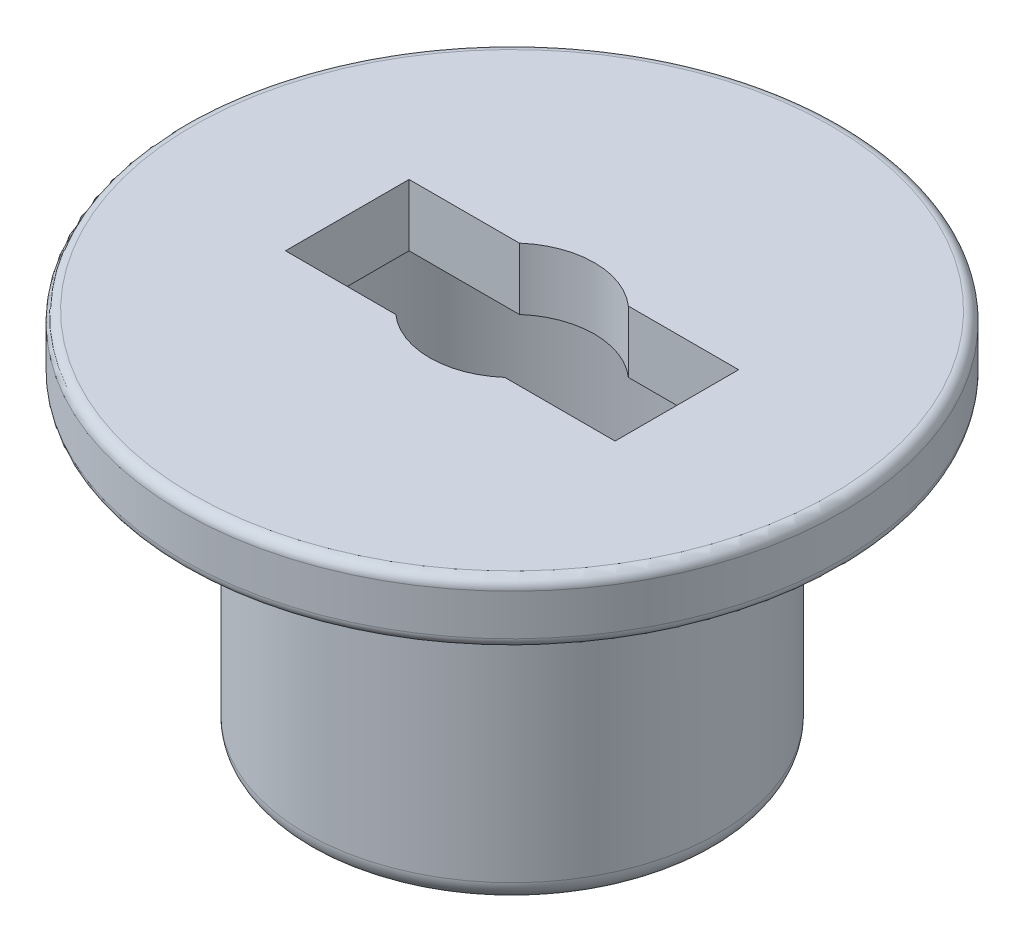
ISO-10303-21;
HEADER;
FILE_DESCRIPTION(('STEP AP214'),'2;1');
FILE_NAME('part.step','',(''),(''),'','','');
FILE_SCHEMA(('AUTOMOTIVE_DESIGN { 1 0 10303 214 1 1 1 1 }'));
ENDSEC;
DATA;
#1=APPLICATION_CONTEXT('core data for automotive mechanical design processes');
#2=APPLICATION_PROTOCOL_DEFINITION('international standard','automotive_design',2000,#1);
#3=PRODUCT_CONTEXT('',#1,'mechanical');
#4=PRODUCT('Part','Part','',(#3));
#5=PRODUCT_RELATED_PRODUCT_CATEGORY('part','',(#4));
#6=PRODUCT_DEFINITION_FORMATION('','',#4);
#7=PRODUCT_DEFINITION_CONTEXT('part definition',#1,'design');
#8=PRODUCT_DEFINITION('design','',#6,#7);
#9=PRODUCT_DEFINITION_SHAPE('','',#8);
#10=(LENGTH_UNIT() NAMED_UNIT(*) SI_UNIT(.MILLI.,.METRE.));
#11=(NAMED_UNIT(*) PLANE_ANGLE_UNIT() SI_UNIT($,.RADIAN.));
#12=(NAMED_UNIT(*) SI_UNIT($,.STERADIAN.) SOLID_ANGLE_UNIT());
#13=UNCERTAINTY_MEASURE_WITH_UNIT(LENGTH_MEASURE(1.E-05),#10,'distance_accuracy_value','');
#14=(GEOMETRIC_REPRESENTATION_CONTEXT(3) GLOBAL_UNCERTAINTY_ASSIGNED_CONTEXT((#13)) GLOBAL_UNIT_ASSIGNED_CONTEXT((#10,
#11,#12)) REPRESENTATION_CONTEXT('',''));
#15=CARTESIAN_POINT('',(0.,0.,0.));
#16=DIRECTION('',(0.,0.,1.));
#17=DIRECTION('',(1.,0.,0.));
#18=AXIS2_PLACEMENT_3D('',#15,#16,#17);
#19=CARTESIAN_POINT('',(0.,3.,0.));
#20=DIRECTION('',(0.,1.,0.));
#21=DIRECTION('',(0.,0.,1.));
#22=AXIS2_PLACEMENT_3D('',#19,#20,#21);
#23=PLANE('',#22);
#24=CARTESIAN_POINT('',(0.,3.,0.));
#25=DIRECTION('',(0.,1.,0.));
#26=DIRECTION('',(0.,0.,1.));
#27=AXIS2_PLACEMENT_3D('',#24,#25,#26);
#28=CIRCLE('',#27,15.5);
#29=CARTESIAN_POINT('',(0.,3.,15.5));
#30=VERTEX_POINT('',#29);
#31=EDGE_CURVE('E11',#30,#30,#28,.T.);
#32=ORIENTED_EDGE('',*,*,#31,.T.);
#33=EDGE_LOOP('',(#32));
#34=FACE_BOUND('',#33,.T.);
#35=DIRECTION('',(0.,0.,-1.));
#36=VECTOR('',#35,1.);
#37=CARTESIAN_POINT('',(8.,3.,-3.));
#38=LINE('',#37,#36);
#39=CARTESIAN_POINT('',(8.,3.,3.));
#40=VERTEX_POINT('',#39);
#41=CARTESIAN_POINT('',(8.,3.,-3.));
#42=VERTEX_POINT('',#41);
#43=EDGE_CURVE('E227',#40,#42,#38,.T.);
#44=ORIENTED_EDGE('',*,*,#43,.F.);
#45=DIRECTION('',(1.,0.,0.));
#46=VECTOR('',#45,1.);
#47=CARTESIAN_POINT('',(2.64575131106459,3.,3.));
#48=LINE('',#47,#46);
#49=CARTESIAN_POINT('',(2.64575131106459,3.,3.));
#50=VERTEX_POINT('',#49);
#51=EDGE_CURVE('E145',#50,#40,#48,.T.);
#52=ORIENTED_EDGE('',*,*,#51,.F.);
#53=CARTESIAN_POINT('',(0.,3.,0.));
#54=DIRECTION('',(0.,1.,0.));
#55=DIRECTION('',(0.,0.,1.));
#56=AXIS2_PLACEMENT_3D('',#53,#54,#55);
#57=CIRCLE('',#56,4.);
#58=CARTESIAN_POINT('',(-2.64575131106459,3.,3.));
#59=VERTEX_POINT('',#58);
#60=EDGE_CURVE('E56',#59,#50,#57,.T.);
#61=ORIENTED_EDGE('',*,*,#60,.F.);
#62=DIRECTION('',(1.,0.,0.));
#63=VECTOR('',#62,1.);
#64=CARTESIAN_POINT('',(-8.,3.,3.));
#65=LINE('',#64,#63);
#66=CARTESIAN_POINT('',(-8.,3.,3.));
#67=VERTEX_POINT('',#66);
#68=EDGE_CURVE('E121',#67,#59,#65,.T.);
#69=ORIENTED_EDGE('',*,*,#68,.F.);
#70=DIRECTION('',(0.,0.,1.));
#71=VECTOR('',#70,1.);
#72=CARTESIAN_POINT('',(-8.,3.,-3.));
#73=LINE('',#72,#71);
#74=CARTESIAN_POINT('',(-8.,3.,-3.));
#75=VERTEX_POINT('',#74);
#76=EDGE_CURVE('E109',#75,#67,#73,.T.);
#77=ORIENTED_EDGE('',*,*,#76,.F.);
#78=DIRECTION('',(-1.,0.,0.));
#79=VECTOR('',#78,1.);
#80=CARTESIAN_POINT('',(-8.,3.,-3.));
#81=LINE('',#80,#79);
#82=CARTESIAN_POINT('',(-2.64575131106459,3.,-3.));
#83=VERTEX_POINT('',#82);
#84=EDGE_CURVE('E97',#83,#75,#81,.T.);
#85=ORIENTED_EDGE('',*,*,#84,.F.);
#86=CARTESIAN_POINT('',(0.,3.,0.));
#87=DIRECTION('',(0.,1.,0.));
#88=DIRECTION('',(0.,0.,1.));
#89=AXIS2_PLACEMENT_3D('',#86,#87,#88);
#90=CIRCLE('',#89,4.);
#91=CARTESIAN_POINT('',(2.64575131106459,3.,-3.));
#92=VERTEX_POINT('',#91);
#93=EDGE_CURVE('E110',#92,#83,#90,.T.);
#94=ORIENTED_EDGE('',*,*,#93,.F.);
#95=DIRECTION('',(-1.,0.,0.));
#96=VECTOR('',#95,1.);
#97=CARTESIAN_POINT('',(2.64575131106459,3.,-3.));
#98=LINE('',#97,#96);
#99=EDGE_CURVE('E229',#42,#92,#98,.T.);
#100=ORIENTED_EDGE('',*,*,#99,.F.);
#101=EDGE_LOOP('',(#44,#52,#61,#69,#77,#85,#94,#100));
#102=FACE_BOUND('',#101,.T.);
#103=ADVANCED_FACE('F35',(#34,#102),#23,.T.);
#104=CARTESIAN_POINT('',(0.,0.,0.));
#105=DIRECTION('',(0.,1.,0.));
#106=DIRECTION('',(0.,0.,1.));
#107=AXIS2_PLACEMENT_3D('',#104,#105,#106);
#108=PLANE('',#107);
#109=CARTESIAN_POINT('',(0.,0.,0.));
#110=DIRECTION('',(0.,1.,0.));
#111=DIRECTION('',(0.,0.,1.));
#112=AXIS2_PLACEMENT_3D('',#109,#110,#111);
#113=CIRCLE('',#112,15.5);
#114=CARTESIAN_POINT('',(0.,0.,15.5));
#115=VERTEX_POINT('',#114);
#116=EDGE_CURVE('E43',#115,#115,#113,.F.);
#117=ORIENTED_EDGE('',*,*,#116,.T.);
#118=EDGE_LOOP('',(#117));
#119=FACE_BOUND('',#118,.T.);
#120=CARTESIAN_POINT('',(0.,0.,0.));
#121=DIRECTION('',(0.,1.,0.));
#122=DIRECTION('',(0.,0.,1.));
#123=AXIS2_PLACEMENT_3D('',#120,#121,#122);
#124=CIRCLE('',#123,10.);
#125=CARTESIAN_POINT('',(0.,0.,10.));
#126=VERTEX_POINT('',#125);
#127=EDGE_CURVE('E162',#126,#126,#124,.F.);
#128=ORIENTED_EDGE('',*,*,#127,.F.);
#129=EDGE_LOOP('',(#128));
#130=FACE_BOUND('',#129,.T.);
#131=CARTESIAN_POINT('',(-13.,0.,0.));
#132=DIRECTION('',(0.,1.,0.));
#133=DIRECTION('',(0.,0.,1.));
#134=AXIS2_PLACEMENT_3D('',#131,#132,#133);
#135=CIRCLE('',#134,1.);
#136=CARTESIAN_POINT('',(-13.,0.,1.));
#137=VERTEX_POINT('',#136);
#138=EDGE_CURVE('E159',#137,#137,#135,.F.);
#139=ORIENTED_EDGE('',*,*,#138,.F.);
#140=EDGE_LOOP('',(#139));
#141=FACE_BOUND('',#140,.T.);
#142=ADVANCED_FACE('F176',(#119,#130,#141),#108,.F.);
#143=CARTESIAN_POINT('',(0.,3.,0.));
#144=DIRECTION('',(0.,-1.,0.));
#145=DIRECTION('',(0.,0.,-1.));
#146=AXIS2_PLACEMENT_3D('',#143,#144,#145);
#147=CYLINDRICAL_SURFACE('',#146,16.);
#148=CARTESIAN_POINT('',(0.,0.5,0.));
#149=DIRECTION('',(0.,1.,0.));
#150=DIRECTION('',(0.,0.,1.));
#151=AXIS2_PLACEMENT_3D('',#148,#149,#150);
#152=CIRCLE('',#151,16.);
#153=CARTESIAN_POINT('',(0.,0.5,16.));
#154=VERTEX_POINT('',#153);
#155=EDGE_CURVE('E171',#154,#154,#152,.T.);
#156=ORIENTED_EDGE('',*,*,#155,.T.);
#157=EDGE_LOOP('',(#156));
#158=FACE_BOUND('',#157,.T.);
#159=CARTESIAN_POINT('',(0.,2.5,0.));
#160=DIRECTION('',(0.,1.,0.));
#161=DIRECTION('',(0.,0.,1.));
#162=AXIS2_PLACEMENT_3D('',#159,#160,#161);
#163=CIRCLE('',#162,16.);
#164=CARTESIAN_POINT('',(0.,2.5,16.));
#165=VERTEX_POINT('',#164);
#166=EDGE_CURVE('E168',#165,#165,#163,.F.);
#167=ORIENTED_EDGE('',*,*,#166,.T.);
#168=EDGE_LOOP('',(#167));
#169=FACE_BOUND('',#168,.T.);
#170=ADVANCED_FACE('F185',(#158,#169),#147,.T.);
#171=CARTESIAN_POINT('',(2.64575131106459,3.,3.));
#172=DIRECTION('',(0.,0.,-1.));
#173=DIRECTION('',(-1.,0.,0.));
#174=AXIS2_PLACEMENT_3D('',#171,#172,#173);
#175=PLANE('',#174);
#176=DIRECTION('',(1.,0.,0.));
#177=VECTOR('',#176,1.);
#178=CARTESIAN_POINT('',(2.64575131106459,0.,3.));
#179=LINE('',#178,#177);
#180=CARTESIAN_POINT('',(2.64575131106459,0.,3.));
#181=VERTEX_POINT('',#180);
#182=CARTESIAN_POINT('',(8.,0.,3.));
#183=VERTEX_POINT('',#182);
#184=EDGE_CURVE('E79',#181,#183,#179,.T.);
#185=ORIENTED_EDGE('',*,*,#184,.F.);
#186=DIRECTION('',(0.,-1.,0.));
#187=VECTOR('',#186,1.);
#188=CARTESIAN_POINT('',(2.64575131106459,3.,3.));
#189=LINE('',#188,#187);
#190=EDGE_CURVE('E127',#50,#181,#189,.T.);
#191=ORIENTED_EDGE('',*,*,#190,.F.);
#192=ORIENTED_EDGE('',*,*,#51,.T.);
#193=DIRECTION('',(0.,-1.,0.));
#194=VECTOR('',#193,1.);
#195=CARTESIAN_POINT('',(8.,3.,3.));
#196=LINE('',#195,#194);
#197=EDGE_CURVE('E156',#40,#183,#196,.T.);
#198=ORIENTED_EDGE('',*,*,#197,.T.);
#199=EDGE_LOOP('',(#185,#191,#192,#198));
#200=FACE_BOUND('',#199,.T.);
#201=ADVANCED_FACE('F188',(#200),#175,.T.);
#202=CARTESIAN_POINT('',(8.,3.,-3.));
#203=DIRECTION('',(-1.,0.,0.));
#204=DIRECTION('',(0.,0.,1.));
#205=AXIS2_PLACEMENT_3D('',#202,#203,#204);
#206=PLANE('',#205);
#207=DIRECTION('',(0.,0.,-1.));
#208=VECTOR('',#207,1.);
#209=CARTESIAN_POINT('',(8.,0.,-3.));
#210=LINE('',#209,#208);
#211=CARTESIAN_POINT('',(8.,0.,-3.));
#212=VERTEX_POINT('',#211);
#213=EDGE_CURVE('E129',#183,#212,#210,.T.);
#214=ORIENTED_EDGE('',*,*,#213,.F.);
#215=ORIENTED_EDGE('',*,*,#197,.F.);
#216=ORIENTED_EDGE('',*,*,#43,.T.);
#217=DIRECTION('',(0.,-1.,0.));
#218=VECTOR('',#217,1.);
#219=CARTESIAN_POINT('',(8.,3.,-3.));
#220=LINE('',#219,#218);
#221=EDGE_CURVE('E153',#42,#212,#220,.T.);
#222=ORIENTED_EDGE('',*,*,#221,.T.);
#223=EDGE_LOOP('',(#214,#215,#216,#222));
#224=FACE_BOUND('',#223,.T.);
#225=ADVANCED_FACE('F242',(#224),#206,.T.);
#226=CARTESIAN_POINT('',(2.64575131106459,3.,-3.));
#227=DIRECTION('',(0.,0.,1.));
#228=DIRECTION('',(1.,0.,0.));
#229=AXIS2_PLACEMENT_3D('',#226,#227,#228);
#230=PLANE('',#229);
#231=DIRECTION('',(-1.,0.,0.));
#232=VECTOR('',#231,1.);
#233=CARTESIAN_POINT('',(2.64575131106459,0.,-3.));
#234=LINE('',#233,#232);
#235=CARTESIAN_POINT('',(2.64575131106459,0.,-3.));
#236=VERTEX_POINT('',#235);
#237=EDGE_CURVE('E132',#212,#236,#234,.T.);
#238=ORIENTED_EDGE('',*,*,#237,.F.);
#239=ORIENTED_EDGE('',*,*,#221,.F.);
#240=ORIENTED_EDGE('',*,*,#99,.T.);
#241=DIRECTION('',(0.,-1.,0.));
#242=VECTOR('',#241,1.);
#243=CARTESIAN_POINT('',(2.64575131106459,3.,-3.));
#244=LINE('',#243,#242);
#245=EDGE_CURVE('E150',#92,#236,#244,.T.);
#246=ORIENTED_EDGE('',*,*,#245,.T.);
#247=EDGE_LOOP('',(#238,#239,#240,#246));
#248=FACE_BOUND('',#247,.T.);
#249=ADVANCED_FACE('F240',(#248),#230,.T.);
#250=CARTESIAN_POINT('',(0.,3.,0.));
#251=DIRECTION('',(0.,-1.,0.));
#252=DIRECTION('',(0.,0.,-1.));
#253=AXIS2_PLACEMENT_3D('',#250,#251,#252);
#254=CYLINDRICAL_SURFACE('',#253,4.);
#255=CARTESIAN_POINT('',(0.,0.,0.));
#256=DIRECTION('',(0.,1.,0.));
#257=DIRECTION('',(0.,0.,1.));
#258=AXIS2_PLACEMENT_3D('',#255,#256,#257);
#259=CIRCLE('',#258,4.);
#260=CARTESIAN_POINT('',(-2.64575131106459,0.,-3.));
#261=VERTEX_POINT('',#260);
#262=EDGE_CURVE('E135',#236,#261,#259,.T.);
#263=ORIENTED_EDGE('',*,*,#262,.F.);
#264=ORIENTED_EDGE('',*,*,#245,.F.);
#265=ORIENTED_EDGE('',*,*,#93,.T.);
#266=DIRECTION('',(0.,-1.,0.));
#267=VECTOR('',#266,1.);
#268=CARTESIAN_POINT('',(-2.64575131106459,3.,-3.));
#269=LINE('',#268,#267);
#270=EDGE_CURVE('E105',#83,#261,#269,.T.);
#271=ORIENTED_EDGE('',*,*,#270,.T.);
#272=EDGE_LOOP('',(#263,#264,#265,#271));
#273=FACE_BOUND('',#272,.T.);
#274=ADVANCED_FACE('F233',(#273),#254,.F.);
#275=CARTESIAN_POINT('',(-8.,3.,-3.));
#276=DIRECTION('',(0.,0.,1.));
#277=DIRECTION('',(1.,0.,0.));
#278=AXIS2_PLACEMENT_3D('',#275,#276,#277);
#279=PLANE('',#278);
#280=DIRECTION('',(-1.,0.,0.));
#281=VECTOR('',#280,1.);
#282=CARTESIAN_POINT('',(-8.,0.,-3.));
#283=LINE('',#282,#281);
#284=CARTESIAN_POINT('',(-8.,0.,-3.));
#285=VERTEX_POINT('',#284);
#286=EDGE_CURVE('E138',#261,#285,#283,.T.);
#287=ORIENTED_EDGE('',*,*,#286,.F.);
#288=ORIENTED_EDGE('',*,*,#270,.F.);
#289=ORIENTED_EDGE('',*,*,#84,.T.);
#290=DIRECTION('',(0.,-1.,0.));
#291=VECTOR('',#290,1.);
#292=CARTESIAN_POINT('',(-8.,3.,-3.));
#293=LINE('',#292,#291);
#294=EDGE_CURVE('E102',#75,#285,#293,.T.);
#295=ORIENTED_EDGE('',*,*,#294,.T.);
#296=EDGE_LOOP('',(#287,#288,#289,#295));
#297=FACE_BOUND('',#296,.T.);
#298=ADVANCED_FACE('F100',(#297),#279,.T.);
#299=CARTESIAN_POINT('',(-8.,3.,-3.));
#300=DIRECTION('',(1.,0.,0.));
#301=DIRECTION('',(0.,0.,-1.));
#302=AXIS2_PLACEMENT_3D('',#299,#300,#301);
#303=PLANE('',#302);
#304=DIRECTION('',(0.,0.,1.));
#305=VECTOR('',#304,1.);
#306=CARTESIAN_POINT('',(-8.,0.,-3.));
#307=LINE('',#306,#305);
#308=CARTESIAN_POINT('',(-8.,0.,3.));
#309=VERTEX_POINT('',#308);
#310=EDGE_CURVE('E116',#285,#309,#307,.T.);
#311=ORIENTED_EDGE('',*,*,#310,.F.);
#312=ORIENTED_EDGE('',*,*,#294,.F.);
#313=ORIENTED_EDGE('',*,*,#76,.T.);
#314=DIRECTION('',(0.,-1.,0.));
#315=VECTOR('',#314,1.);
#316=CARTESIAN_POINT('',(-8.,3.,3.));
#317=LINE('',#316,#315);
#318=EDGE_CURVE('E117',#67,#309,#317,.T.);
#319=ORIENTED_EDGE('',*,*,#318,.T.);
#320=EDGE_LOOP('',(#311,#312,#313,#319));
#321=FACE_BOUND('',#320,.T.);
#322=ADVANCED_FACE('F113',(#321),#303,.T.);
#323=CARTESIAN_POINT('',(-8.,3.,3.));
#324=DIRECTION('',(0.,0.,-1.));
#325=DIRECTION('',(-1.,0.,0.));
#326=AXIS2_PLACEMENT_3D('',#323,#324,#325);
#327=PLANE('',#326);
#328=DIRECTION('',(1.,0.,0.));
#329=VECTOR('',#328,1.);
#330=CARTESIAN_POINT('',(-8.,0.,3.));
#331=LINE('',#330,#329);
#332=CARTESIAN_POINT('',(-2.64575131106459,0.,3.));
#333=VERTEX_POINT('',#332);
#334=EDGE_CURVE('E70',#309,#333,#331,.T.);
#335=ORIENTED_EDGE('',*,*,#334,.F.);
#336=ORIENTED_EDGE('',*,*,#318,.F.);
#337=ORIENTED_EDGE('',*,*,#68,.T.);
#338=DIRECTION('',(0.,-1.,0.));
#339=VECTOR('',#338,1.);
#340=CARTESIAN_POINT('',(-2.64575131106459,3.,3.));
#341=LINE('',#340,#339);
#342=EDGE_CURVE('E50',#59,#333,#341,.T.);
#343=ORIENTED_EDGE('',*,*,#342,.T.);
#344=EDGE_LOOP('',(#335,#336,#337,#343));
#345=FACE_BOUND('',#344,.T.);
#346=ADVANCED_FACE('F254',(#345),#327,.T.);
#347=CARTESIAN_POINT('',(0.,3.,0.));
#348=DIRECTION('',(0.,-1.,0.));
#349=DIRECTION('',(0.,0.,-1.));
#350=AXIS2_PLACEMENT_3D('',#347,#348,#349);
#351=CYLINDRICAL_SURFACE('',#350,4.);
#352=CARTESIAN_POINT('',(0.,0.,0.));
#353=DIRECTION('',(0.,1.,0.));
#354=DIRECTION('',(0.,0.,1.));
#355=AXIS2_PLACEMENT_3D('',#352,#353,#354);
#356=CIRCLE('',#355,4.);
#357=EDGE_CURVE('E143',#333,#181,#356,.T.);
#358=ORIENTED_EDGE('',*,*,#357,.F.);
#359=ORIENTED_EDGE('',*,*,#342,.F.);
#360=ORIENTED_EDGE('',*,*,#60,.T.);
#361=ORIENTED_EDGE('',*,*,#190,.T.);
#362=EDGE_LOOP('',(#358,#359,#360,#361));
#363=FACE_BOUND('',#362,.T.);
#364=ADVANCED_FACE('F246',(#363),#351,.F.);
#365=CARTESIAN_POINT('',(-13.,-3.,0.));
#366=DIRECTION('',(0.,1.,0.));
#367=DIRECTION('',(0.,0.,1.));
#368=AXIS2_PLACEMENT_3D('',#365,#366,#367);
#369=CYLINDRICAL_SURFACE('',#368,1.);
#370=CARTESIAN_POINT('',(-13.,-3.,0.));
#371=DIRECTION('',(0.,-1.,0.));
#372=DIRECTION('',(0.,0.,-1.));
#373=AXIS2_PLACEMENT_3D('',#370,#371,#372);
#374=CIRCLE('',#373,1.);
#375=CARTESIAN_POINT('',(-13.,-3.,-1.));
#376=VERTEX_POINT('',#375);
#377=EDGE_CURVE('E130',#376,#376,#374,.T.);
#378=ORIENTED_EDGE('',*,*,#377,.F.);
#379=EDGE_LOOP('',(#378));
#380=FACE_BOUND('',#379,.T.);
#381=ORIENTED_EDGE('',*,*,#138,.T.);
#382=EDGE_LOOP('',(#381));
#383=FACE_BOUND('',#382,.T.);
#384=ADVANCED_FACE('F261',(#380,#383),#369,.T.);
#385=CARTESIAN_POINT('',(-13.,-3.,0.));
#386=DIRECTION('',(0.,-1.,0.));
#387=DIRECTION('',(0.,0.,-1.));
#388=AXIS2_PLACEMENT_3D('',#385,#386,#387);
#389=PLANE('',#388);
#390=ORIENTED_EDGE('',*,*,#377,.T.);
#391=EDGE_LOOP('',(#390));
#392=FACE_BOUND('',#391,.T.);
#393=ADVANCED_FACE('F307',(#392),#389,.T.);
#394=CARTESIAN_POINT('',(0.,-15.,0.));
#395=DIRECTION('',(0.,1.,0.));
#396=DIRECTION('',(0.,0.,1.));
#397=AXIS2_PLACEMENT_3D('',#394,#395,#396);
#398=CYLINDRICAL_SURFACE('',#397,10.);
#399=CARTESIAN_POINT('',(0.,-14.,0.));
#400=DIRECTION('',(0.,-1.,0.));
#401=DIRECTION('',(0.,0.,-1.));
#402=AXIS2_PLACEMENT_3D('',#399,#400,#401);
#403=CIRCLE('',#402,10.);
#404=CARTESIAN_POINT('',(0.,-14.,-10.));
#405=VERTEX_POINT('',#404);
#406=EDGE_CURVE('E165',#405,#405,#403,.F.);
#407=ORIENTED_EDGE('',*,*,#406,.T.);
#408=EDGE_LOOP('',(#407));
#409=FACE_BOUND('',#408,.T.);
#410=ORIENTED_EDGE('',*,*,#127,.T.);
#411=EDGE_LOOP('',(#410));
#412=FACE_BOUND('',#411,.T.);
#413=ADVANCED_FACE('F302',(#409,#412),#398,.T.);
#414=CARTESIAN_POINT('',(0.,-15.001,0.));
#415=DIRECTION('',(0.,1.,0.));
#416=DIRECTION('',(0.,0.,1.));
#417=AXIS2_PLACEMENT_3D('',#414,#415,#416);
#418=CYLINDRICAL_SURFACE('',#417,9.);
#419=CARTESIAN_POINT('',(0.,-15.,0.));
#420=DIRECTION('',(0.,-1.,0.));
#421=DIRECTION('',(0.,0.,-1.));
#422=AXIS2_PLACEMENT_3D('',#419,#420,#421);
#423=CIRCLE('',#422,9.);
#424=CARTESIAN_POINT('',(0.,-15.,9.));
#425=VERTEX_POINT('',#424);
#426=EDGE_CURVE('E217',#425,#425,#423,.F.);
#427=CARTESIAN_POINT('',(0.,0.,0.));
#428=DIRECTION('',(0.,1.,0.));
#429=DIRECTION('',(0.,0.,1.));
#430=AXIS2_PLACEMENT_3D('',#427,#428,#429);
#431=CIRCLE('',#430,9.);
#432=CARTESIAN_POINT('',(0.,0.,9.));
#433=VERTEX_POINT('',#432);
#434=EDGE_CURVE('E219',#433,#433,#431,.T.);
#435=CARTESIAN_POINT('',(0.,-15.,9.));
#436=CARTESIAN_POINT('',(0.,-14.84375,9.));
#437=CARTESIAN_POINT('',(0.,-14.6875,9.));
#438=CARTESIAN_POINT('',(0.,-14.375,9.));
#439=CARTESIAN_POINT('',(0.,-14.21875,9.));
#440=CARTESIAN_POINT('',(0.,-13.90625,9.));
#441=CARTESIAN_POINT('',(0.,-13.75,9.));
#442=CARTESIAN_POINT('',(0.,-13.4375,9.));
#443=CARTESIAN_POINT('',(0.,-13.28125,9.));
#444=CARTESIAN_POINT('',(0.,-12.96875,9.));
#445=CARTESIAN_POINT('',(0.,-12.8125,9.));
#446=CARTESIAN_POINT('',(0.,-12.5,9.));
#447=CARTESIAN_POINT('',(0.,-12.34375,9.));
#448=CARTESIAN_POINT('',(0.,-12.03125,9.));
#449=CARTESIAN_POINT('',(0.,-11.875,9.));
#450=CARTESIAN_POINT('',(0.,-11.5625,9.));
#451=CARTESIAN_POINT('',(0.,-11.40625,9.));
#452=CARTESIAN_POINT('',(0.,-11.09375,9.));
#453=CARTESIAN_POINT('',(0.,-10.9375,9.));
#454=CARTESIAN_POINT('',(0.,-10.625,9.));
#455=CARTESIAN_POINT('',(0.,-10.46875,9.));
#456=CARTESIAN_POINT('',(0.,-10.15625,9.));
#457=CARTESIAN_POINT('',(0.,-10.,9.));
#458=CARTESIAN_POINT('',(0.,-9.6875,9.));
#459=CARTESIAN_POINT('',(0.,-9.53125,9.));
#460=CARTESIAN_POINT('',(0.,-9.21875,9.));
#461=CARTESIAN_POINT('',(0.,-9.0625,9.));
#462=CARTESIAN_POINT('',(0.,-8.75,9.));
#463=CARTESIAN_POINT('',(0.,-8.59375,9.));
#464=CARTESIAN_POINT('',(0.,-8.28125,9.));
#465=CARTESIAN_POINT('',(0.,-8.125,9.));
#466=CARTESIAN_POINT('',(0.,-7.8125,9.));
#467=CARTESIAN_POINT('',(0.,-7.65625,9.));
#468=CARTESIAN_POINT('',(0.,-7.34375,9.));
#469=CARTESIAN_POINT('',(0.,-7.1875,9.));
#470=CARTESIAN_POINT('',(0.,-6.875,9.));
#471=CARTESIAN_POINT('',(0.,-6.71875,9.));
#472=CARTESIAN_POINT('',(0.,-6.40625,9.));
#473=CARTESIAN_POINT('',(0.,-6.25,9.));
#474=CARTESIAN_POINT('',(0.,-5.9375,9.));
#475=CARTESIAN_POINT('',(0.,-5.78125,9.));
#476=CARTESIAN_POINT('',(0.,-5.46875,9.));
#477=CARTESIAN_POINT('',(0.,-5.3125,9.));
#478=CARTESIAN_POINT('',(0.,-5.,9.));
#479=CARTESIAN_POINT('',(0.,-4.84375,9.));
#480=CARTESIAN_POINT('',(0.,-4.53125,9.));
#481=CARTESIAN_POINT('',(0.,-4.375,9.));
#482=CARTESIAN_POINT('',(0.,-4.0625,9.));
#483=CARTESIAN_POINT('',(0.,-3.90625,9.));
#484=CARTESIAN_POINT('',(0.,-3.59375,9.));
#485=CARTESIAN_POINT('',(0.,-3.4375,9.));
#486=CARTESIAN_POINT('',(0.,-3.125,9.));
#487=CARTESIAN_POINT('',(0.,-2.96875,9.));
#488=CARTESIAN_POINT('',(0.,-2.65625,9.));
#489=CARTESIAN_POINT('',(0.,-2.5,9.));
#490=CARTESIAN_POINT('',(0.,-2.1875,9.));
#491=CARTESIAN_POINT('',(0.,-2.03125,9.));
#492=CARTESIAN_POINT('',(0.,-1.71875,9.));
#493=CARTESIAN_POINT('',(0.,-1.5625,9.));
#494=CARTESIAN_POINT('',(0.,-1.25,9.));
#495=CARTESIAN_POINT('',(0.,-1.09375,9.));
#496=CARTESIAN_POINT('',(0.,-0.781250000000001,9.));
#497=CARTESIAN_POINT('',(0.,-0.625000000000001,9.));
#498=CARTESIAN_POINT('',(0.,-0.3125,9.));
#499=CARTESIAN_POINT('',(0.,-0.15625,9.));
#500=CARTESIAN_POINT('',(0.,0.,9.));
#501=B_SPLINE_CURVE_WITH_KNOTS('',3,(#435,#436,#437,#438,#439,#440,#441,#442,#443,#444,#445,
#446,#447,#448,#449,#450,#451,#452,#453,#454,#455,#456,#457,#458,#459,#460,#461,#462,#463,#464,
#465,#466,#467,#468,#469,#470,#471,#472,#473,#474,#475,#476,#477,#478,#479,#480,#481,#482,#483,
#484,#485,#486,#487,#488,#489,#490,#491,#492,#493,#494,#495,#496,#497,#498,#499,#500),
.UNSPECIFIED.,.F.,.F.,(4,2,2,2,2,2,2,2,2,2,2,2,2,2,2,2,2,2,2,2,2,2,2,2,2,2,2,2,2,2,2,2,4),(0.,
0.468749999999999,0.937499999999999,1.40625,1.875,2.34375,2.8125,3.28125,3.75,4.21875,4.6875,
5.15625,5.625,6.09375,6.5625,7.03125,7.5,7.96875,8.4375,8.90625,9.375,9.84375,10.3125,10.78125,
11.25,11.71875,12.1875,12.65625,13.125,13.59375,14.0625,14.53125,15.),.UNSPECIFIED.);
#502=EDGE_CURVE('BSEAM211',#425,#433,#501,.T.);
#503=ORIENTED_EDGE('',*,*,#426,.F.);
#504=ORIENTED_EDGE('',*,*,#434,.T.);
#505=ORIENTED_EDGE('',*,*,#502,.T.);
#506=ORIENTED_EDGE('',*,*,#502,.F.);
#507=EDGE_LOOP('',(#503,#505,#504,#506));
#508=FACE_BOUND('',#507,.T.);
#509=ADVANCED_FACE('F211',(#508),#418,.F.);
#510=CARTESIAN_POINT('',(0.,0.,0.));
#511=DIRECTION('',(0.,1.,0.));
#512=DIRECTION('',(0.,0.,1.));
#513=AXIS2_PLACEMENT_3D('',#510,#511,#512);
#514=PLANE('',#513);
#515=ORIENTED_EDGE('',*,*,#184,.T.);
#516=ORIENTED_EDGE('',*,*,#213,.T.);
#517=ORIENTED_EDGE('',*,*,#237,.T.);
#518=ORIENTED_EDGE('',*,*,#262,.T.);
#519=ORIENTED_EDGE('',*,*,#286,.T.);
#520=ORIENTED_EDGE('',*,*,#310,.T.);
#521=ORIENTED_EDGE('',*,*,#334,.T.);
#522=ORIENTED_EDGE('',*,*,#357,.T.);
#523=EDGE_LOOP('',(#515,#516,#517,#518,#519,#520,#521,#522));
#524=FACE_BOUND('',#523,.T.);
#525=ORIENTED_EDGE('',*,*,#434,.F.);
#526=EDGE_LOOP('',(#525));
#527=FACE_BOUND('',#526,.T.);
#528=ADVANCED_FACE('F206',(#524,#527),#514,.F.);
#529=CARTESIAN_POINT('',(0.,-14.,0.));
#530=DIRECTION('',(0.,-1.,0.));
#531=DIRECTION('',(0.,0.,-1.));
#532=AXIS2_PLACEMENT_3D('',#529,#530,#531);
#533=TOROIDAL_SURFACE('',#532,9.,1.);
#534=ORIENTED_EDGE('',*,*,#406,.F.);
#535=EDGE_LOOP('',(#534));
#536=FACE_BOUND('',#535,.T.);
#537=ORIENTED_EDGE('',*,*,#426,.T.);
#538=EDGE_LOOP('',(#537));
#539=FACE_BOUND('',#538,.T.);
#540=ADVANCED_FACE('F182',(#536,#539),#533,.T.);
#541=CARTESIAN_POINT('',(0.,0.5,0.));
#542=DIRECTION('',(0.,1.,0.));
#543=DIRECTION('',(0.,0.,1.));
#544=AXIS2_PLACEMENT_3D('',#541,#542,#543);
#545=TOROIDAL_SURFACE('',#544,15.5,0.5);
#546=ORIENTED_EDGE('',*,*,#116,.F.);
#547=EDGE_LOOP('',(#546));
#548=FACE_BOUND('',#547,.T.);
#549=ORIENTED_EDGE('',*,*,#155,.F.);
#550=EDGE_LOOP('',(#549));
#551=FACE_BOUND('',#550,.T.);
#552=ADVANCED_FACE('F179',(#548,#551),#545,.T.);
#553=CARTESIAN_POINT('',(0.,2.5,0.));
#554=DIRECTION('',(0.,1.,0.));
#555=DIRECTION('',(0.,0.,1.));
#556=AXIS2_PLACEMENT_3D('',#553,#554,#555);
#557=TOROIDAL_SURFACE('',#556,15.5,0.5);
#558=ORIENTED_EDGE('',*,*,#166,.F.);
#559=EDGE_LOOP('',(#558));
#560=FACE_BOUND('',#559,.T.);
#561=ORIENTED_EDGE('',*,*,#31,.F.);
#562=EDGE_LOOP('',(#561));
#563=FACE_BOUND('',#562,.T.);
#564=ADVANCED_FACE('F37',(#560,#563),#557,.T.);
#565=CLOSED_SHELL('',(#103,#142,#170,#201,#225,#249,#274,#298,#322,#346,#364,#384,#393,#413,
#509,#528,#540,#552,#564));
#566=MANIFOLD_SOLID_BREP('B2',#565);
#567=ADVANCED_BREP_SHAPE_REPRESENTATION('',(#18,#566),#14);
#568=SHAPE_DEFINITION_REPRESENTATION(#9,#567);
ENDSEC;
END-ISO-10303-21;
